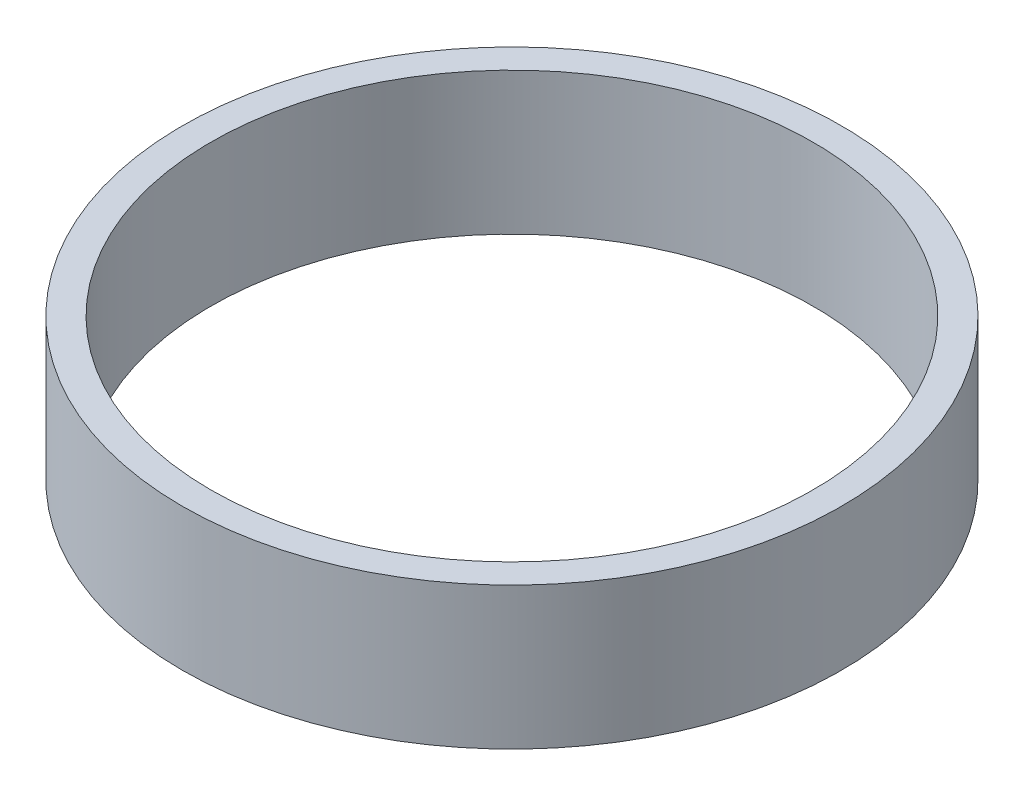
ISO-10303-21;
HEADER;
FILE_DESCRIPTION(('STEP AP214'),'2;1');
FILE_NAME('part.step','',(''),(''),'','','');
FILE_SCHEMA(('AUTOMOTIVE_DESIGN { 1 0 10303 214 1 1 1 1 }'));
ENDSEC;
DATA;
#1=APPLICATION_CONTEXT('core data for automotive mechanical design processes');
#2=APPLICATION_PROTOCOL_DEFINITION('international standard','automotive_design',2000,#1);
#3=PRODUCT_CONTEXT('',#1,'mechanical');
#4=PRODUCT('Part','Part','',(#3));
#5=PRODUCT_RELATED_PRODUCT_CATEGORY('part','',(#4));
#6=PRODUCT_DEFINITION_FORMATION('','',#4);
#7=PRODUCT_DEFINITION_CONTEXT('part definition',#1,'design');
#8=PRODUCT_DEFINITION('design','',#6,#7);
#9=PRODUCT_DEFINITION_SHAPE('','',#8);
#10=(LENGTH_UNIT() NAMED_UNIT(*) SI_UNIT(.MILLI.,.METRE.));
#11=(NAMED_UNIT(*) PLANE_ANGLE_UNIT() SI_UNIT($,.RADIAN.));
#12=(NAMED_UNIT(*) SI_UNIT($,.STERADIAN.) SOLID_ANGLE_UNIT());
#13=UNCERTAINTY_MEASURE_WITH_UNIT(LENGTH_MEASURE(1.E-05),#10,'distance_accuracy_value','');
#14=(GEOMETRIC_REPRESENTATION_CONTEXT(3) GLOBAL_UNCERTAINTY_ASSIGNED_CONTEXT((#13)) GLOBAL_UNIT_ASSIGNED_CONTEXT((#10,
#11,#12)) REPRESENTATION_CONTEXT('',''));
#15=CARTESIAN_POINT('',(0.,0.,0.));
#16=DIRECTION('',(0.,0.,1.));
#17=DIRECTION('',(1.,0.,0.));
#18=AXIS2_PLACEMENT_3D('',#15,#16,#17);
#19=CARTESIAN_POINT('',(0.,5.,0.));
#20=DIRECTION('',(0.,1.,0.));
#21=DIRECTION('',(0.,0.,1.));
#22=AXIS2_PLACEMENT_3D('',#19,#20,#21);
#23=PLANE('',#22);
#24=CARTESIAN_POINT('',(0.,5.,0.));
#25=DIRECTION('',(0.,1.,0.));
#26=DIRECTION('',(0.,0.,1.));
#27=AXIS2_PLACEMENT_3D('',#24,#25,#26);
#28=CIRCLE('',#27,11.6);
#29=CARTESIAN_POINT('',(0.,5.,11.6));
#30=VERTEX_POINT('',#29);
#31=EDGE_CURVE('E10',#30,#30,#28,.T.);
#32=ORIENTED_EDGE('',*,*,#31,.T.);
#33=EDGE_LOOP('',(#32));
#34=FACE_BOUND('',#33,.T.);
#35=CARTESIAN_POINT('',(0.,5.,0.));
#36=DIRECTION('',(0.,1.,0.));
#37=DIRECTION('',(0.,0.,1.));
#38=AXIS2_PLACEMENT_3D('',#35,#36,#37);
#39=CIRCLE('',#38,10.6);
#40=CARTESIAN_POINT('',(0.,5.,10.6));
#41=VERTEX_POINT('',#40);
#42=EDGE_CURVE('E44',#41,#41,#39,.T.);
#43=ORIENTED_EDGE('',*,*,#42,.F.);
#44=EDGE_LOOP('',(#43));
#45=FACE_BOUND('',#44,.T.);
#46=ADVANCED_FACE('F33',(#34,#45),#23,.T.);
#47=CARTESIAN_POINT('',(0.,0.,0.));
#48=DIRECTION('',(0.,1.,0.));
#49=DIRECTION('',(0.,0.,1.));
#50=AXIS2_PLACEMENT_3D('',#47,#48,#49);
#51=PLANE('',#50);
#52=CARTESIAN_POINT('',(0.,0.,0.));
#53=DIRECTION('',(0.,1.,0.));
#54=DIRECTION('',(0.,0.,1.));
#55=AXIS2_PLACEMENT_3D('',#52,#53,#54);
#56=CIRCLE('',#55,11.6);
#57=CARTESIAN_POINT('',(0.,0.,11.6));
#58=VERTEX_POINT('',#57);
#59=EDGE_CURVE('E37',#58,#58,#56,.T.);
#60=ORIENTED_EDGE('',*,*,#59,.F.);
#61=EDGE_LOOP('',(#60));
#62=FACE_BOUND('',#61,.T.);
#63=CARTESIAN_POINT('',(0.,0.,0.));
#64=DIRECTION('',(0.,1.,0.));
#65=DIRECTION('',(0.,0.,1.));
#66=AXIS2_PLACEMENT_3D('',#63,#64,#65);
#67=CIRCLE('',#66,10.6);
#68=CARTESIAN_POINT('',(0.,0.,10.6));
#69=VERTEX_POINT('',#68);
#70=EDGE_CURVE('E46',#69,#69,#67,.T.);
#71=ORIENTED_EDGE('',*,*,#70,.T.);
#72=EDGE_LOOP('',(#71));
#73=FACE_BOUND('',#72,.T.);
#74=ADVANCED_FACE('F56',(#62,#73),#51,.F.);
#75=CARTESIAN_POINT('',(0.,5.,0.));
#76=DIRECTION('',(0.,-1.,0.));
#77=DIRECTION('',(0.,0.,-1.));
#78=AXIS2_PLACEMENT_3D('',#75,#76,#77);
#79=CYLINDRICAL_SURFACE('',#78,11.6);
#80=ORIENTED_EDGE('',*,*,#31,.F.);
#81=EDGE_LOOP('',(#80));
#82=FACE_BOUND('',#81,.T.);
#83=ORIENTED_EDGE('',*,*,#59,.T.);
#84=EDGE_LOOP('',(#83));
#85=FACE_BOUND('',#84,.T.);
#86=ADVANCED_FACE('F35',(#82,#85),#79,.T.);
#87=CARTESIAN_POINT('',(0.,5.,0.));
#88=DIRECTION('',(0.,-1.,0.));
#89=DIRECTION('',(0.,0.,-1.));
#90=AXIS2_PLACEMENT_3D('',#87,#88,#89);
#91=CYLINDRICAL_SURFACE('',#90,10.6);
#92=ORIENTED_EDGE('',*,*,#42,.T.);
#93=EDGE_LOOP('',(#92));
#94=FACE_BOUND('',#93,.T.);
#95=ORIENTED_EDGE('',*,*,#70,.F.);
#96=EDGE_LOOP('',(#95));
#97=FACE_BOUND('',#96,.T.);
#98=ADVANCED_FACE('F52',(#94,#97),#91,.F.);
#99=CLOSED_SHELL('',(#46,#74,#86,#98));
#100=MANIFOLD_SOLID_BREP('B2',#99);
#101=ADVANCED_BREP_SHAPE_REPRESENTATION('',(#18,#100),#14);
#102=SHAPE_DEFINITION_REPRESENTATION(#9,#101);
ENDSEC;
END-ISO-10303-21;
